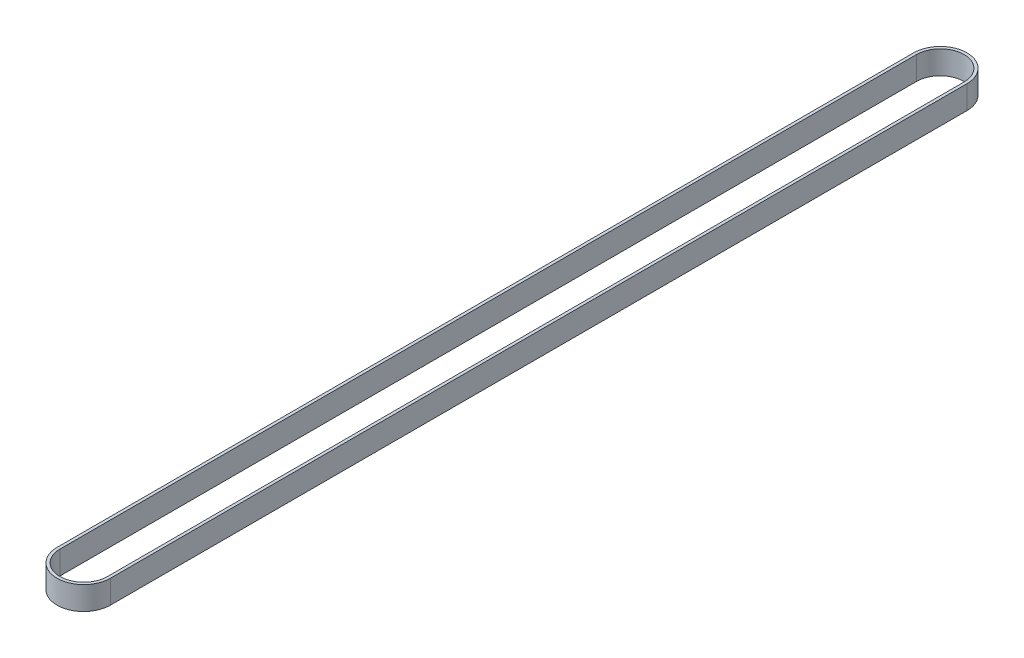
ISO-10303-21;
HEADER;
FILE_DESCRIPTION(('STEP AP214'),'2;1');
FILE_NAME('part.step','',(''),(''),'','','');
FILE_SCHEMA(('AUTOMOTIVE_DESIGN { 1 0 10303 214 1 1 1 1 }'));
ENDSEC;
DATA;
#1=APPLICATION_CONTEXT('core data for automotive mechanical design processes');
#2=APPLICATION_PROTOCOL_DEFINITION('international standard','automotive_design',2000,#1);
#3=PRODUCT_CONTEXT('',#1,'mechanical');
#4=PRODUCT('Part','Part','',(#3));
#5=PRODUCT_RELATED_PRODUCT_CATEGORY('part','',(#4));
#6=PRODUCT_DEFINITION_FORMATION('','',#4);
#7=PRODUCT_DEFINITION_CONTEXT('part definition',#1,'design');
#8=PRODUCT_DEFINITION('design','',#6,#7);
#9=PRODUCT_DEFINITION_SHAPE('','',#8);
#10=(LENGTH_UNIT() NAMED_UNIT(*) SI_UNIT(.MILLI.,.METRE.));
#11=(NAMED_UNIT(*) PLANE_ANGLE_UNIT() SI_UNIT($,.RADIAN.));
#12=(NAMED_UNIT(*) SI_UNIT($,.STERADIAN.) SOLID_ANGLE_UNIT());
#13=UNCERTAINTY_MEASURE_WITH_UNIT(LENGTH_MEASURE(1.E-05),#10,'distance_accuracy_value','');
#14=(GEOMETRIC_REPRESENTATION_CONTEXT(3) GLOBAL_UNCERTAINTY_ASSIGNED_CONTEXT((#13)) GLOBAL_UNIT_ASSIGNED_CONTEXT((#10,
#11,#12)) REPRESENTATION_CONTEXT('',''));
#15=CARTESIAN_POINT('',(0.,0.,0.));
#16=DIRECTION('',(0.,0.,1.));
#17=DIRECTION('',(1.,0.,0.));
#18=AXIS2_PLACEMENT_3D('',#15,#16,#17);
#19=CARTESIAN_POINT('',(0.,6.,110.05));
#20=DIRECTION('',(0.,1.,0.));
#21=DIRECTION('',(0.,0.,1.));
#22=AXIS2_PLACEMENT_3D('',#19,#20,#21);
#23=PLANE('',#22);
#24=CARTESIAN_POINT('',(0.,6.,110.05));
#25=DIRECTION('',(0.,1.,0.));
#26=DIRECTION('',(0.,0.,1.));
#27=AXIS2_PLACEMENT_3D('',#24,#25,#26);
#28=CIRCLE('',#27,6.86000000000003);
#29=CARTESIAN_POINT('',(-6.86000000000003,6.,110.05));
#30=VERTEX_POINT('',#29);
#31=CARTESIAN_POINT('',(6.86000000000003,6.,110.05));
#32=VERTEX_POINT('',#31);
#33=EDGE_CURVE('E142',#30,#32,#28,.T.);
#34=ORIENTED_EDGE('',*,*,#33,.T.);
#35=DIRECTION('',(0.,0.,-1.));
#36=VECTOR('',#35,1.);
#37=CARTESIAN_POINT('',(6.86000000000003,6.,110.05));
#38=LINE('',#37,#36);
#39=CARTESIAN_POINT('',(6.86,6.,-110.05));
#40=VERTEX_POINT('',#39);
#41=EDGE_CURVE('E145',#32,#40,#38,.T.);
#42=ORIENTED_EDGE('',*,*,#41,.T.);
#43=CARTESIAN_POINT('',(0.,6.,-110.05));
#44=DIRECTION('',(0.,1.,0.));
#45=DIRECTION('',(0.,0.,1.));
#46=AXIS2_PLACEMENT_3D('',#43,#44,#45);
#47=CIRCLE('',#46,6.86000000000003);
#48=CARTESIAN_POINT('',(-6.86000000000005,6.,-110.05));
#49=VERTEX_POINT('',#48);
#50=EDGE_CURVE('E148',#40,#49,#47,.T.);
#51=ORIENTED_EDGE('',*,*,#50,.T.);
#52=DIRECTION('',(0.,0.,1.));
#53=VECTOR('',#52,1.);
#54=CARTESIAN_POINT('',(-6.86000000000003,6.,110.05));
#55=LINE('',#54,#53);
#56=EDGE_CURVE('E150',#49,#30,#55,.T.);
#57=ORIENTED_EDGE('',*,*,#56,.T.);
#58=EDGE_LOOP('',(#34,#42,#51,#57));
#59=FACE_BOUND('',#58,.T.);
#60=DIRECTION('',(0.,0.,-1.));
#61=VECTOR('',#60,1.);
#62=CARTESIAN_POINT('',(6.11000000000006,6.,110.05));
#63=LINE('',#62,#61);
#64=CARTESIAN_POINT('',(6.11000000000006,6.,110.05));
#65=VERTEX_POINT('',#64);
#66=CARTESIAN_POINT('',(6.11000000000001,6.,-110.05));
#67=VERTEX_POINT('',#66);
#68=EDGE_CURVE('E114',#65,#67,#63,.T.);
#69=ORIENTED_EDGE('',*,*,#68,.F.);
#70=CARTESIAN_POINT('',(0.,6.,110.05));
#71=DIRECTION('',(0.,1.,0.));
#72=DIRECTION('',(0.,0.,1.));
#73=AXIS2_PLACEMENT_3D('',#70,#71,#72);
#74=CIRCLE('',#73,6.11);
#75=CARTESIAN_POINT('',(-6.10999999999994,6.,110.05));
#76=VERTEX_POINT('',#75);
#77=EDGE_CURVE('E106',#76,#65,#74,.T.);
#78=ORIENTED_EDGE('',*,*,#77,.F.);
#79=DIRECTION('',(0.,0.,1.));
#80=VECTOR('',#79,1.);
#81=CARTESIAN_POINT('',(-6.10999999999994,6.,110.05));
#82=LINE('',#81,#80);
#83=CARTESIAN_POINT('',(-6.10999999999999,6.,-110.05));
#84=VERTEX_POINT('',#83);
#85=EDGE_CURVE('E128',#84,#76,#82,.T.);
#86=ORIENTED_EDGE('',*,*,#85,.F.);
#87=CARTESIAN_POINT('',(0.,6.,-110.05));
#88=DIRECTION('',(0.,1.,0.));
#89=DIRECTION('',(0.,0.,1.));
#90=AXIS2_PLACEMENT_3D('',#87,#88,#89);
#91=CIRCLE('',#90,6.11);
#92=EDGE_CURVE('E126',#67,#84,#91,.T.);
#93=ORIENTED_EDGE('',*,*,#92,.F.);
#94=EDGE_LOOP('',(#69,#78,#86,#93));
#95=FACE_BOUND('',#94,.T.);
#96=ADVANCED_FACE('F41',(#59,#95),#23,.T.);
#97=CARTESIAN_POINT('',(0.,0.,110.05));
#98=DIRECTION('',(0.,1.,0.));
#99=DIRECTION('',(0.,0.,1.));
#100=AXIS2_PLACEMENT_3D('',#97,#98,#99);
#101=PLANE('',#100);
#102=CARTESIAN_POINT('',(0.,0.,110.05));
#103=DIRECTION('',(0.,1.,0.));
#104=DIRECTION('',(0.,0.,1.));
#105=AXIS2_PLACEMENT_3D('',#102,#103,#104);
#106=CIRCLE('',#105,6.86000000000003);
#107=CARTESIAN_POINT('',(-6.86000000000003,0.,110.05));
#108=VERTEX_POINT('',#107);
#109=CARTESIAN_POINT('',(6.86000000000003,0.,110.05));
#110=VERTEX_POINT('',#109);
#111=EDGE_CURVE('E122',#108,#110,#106,.T.);
#112=ORIENTED_EDGE('',*,*,#111,.F.);
#113=DIRECTION('',(0.,0.,1.));
#114=VECTOR('',#113,1.);
#115=CARTESIAN_POINT('',(-6.86000000000003,0.,110.05));
#116=LINE('',#115,#114);
#117=CARTESIAN_POINT('',(-6.86000000000005,0.,-110.05));
#118=VERTEX_POINT('',#117);
#119=EDGE_CURVE('E146',#118,#108,#116,.T.);
#120=ORIENTED_EDGE('',*,*,#119,.F.);
#121=CARTESIAN_POINT('',(0.,0.,-110.05));
#122=DIRECTION('',(0.,1.,0.));
#123=DIRECTION('',(0.,0.,1.));
#124=AXIS2_PLACEMENT_3D('',#121,#122,#123);
#125=CIRCLE('',#124,6.86000000000003);
#126=CARTESIAN_POINT('',(6.86,0.,-110.05));
#127=VERTEX_POINT('',#126);
#128=EDGE_CURVE('E157',#127,#118,#125,.T.);
#129=ORIENTED_EDGE('',*,*,#128,.F.);
#130=DIRECTION('',(0.,0.,-1.));
#131=VECTOR('',#130,1.);
#132=CARTESIAN_POINT('',(6.86000000000003,0.,110.05));
#133=LINE('',#132,#131);
#134=EDGE_CURVE('E155',#110,#127,#133,.T.);
#135=ORIENTED_EDGE('',*,*,#134,.F.);
#136=EDGE_LOOP('',(#112,#120,#129,#135));
#137=FACE_BOUND('',#136,.T.);
#138=CARTESIAN_POINT('',(0.,0.,110.05));
#139=DIRECTION('',(0.,1.,0.));
#140=DIRECTION('',(0.,0.,1.));
#141=AXIS2_PLACEMENT_3D('',#138,#139,#140);
#142=CIRCLE('',#141,6.11);
#143=CARTESIAN_POINT('',(-6.10999999999994,0.,110.05));
#144=VERTEX_POINT('',#143);
#145=CARTESIAN_POINT('',(6.11000000000006,0.,110.05));
#146=VERTEX_POINT('',#145);
#147=EDGE_CURVE('E64',#144,#146,#142,.T.);
#148=ORIENTED_EDGE('',*,*,#147,.T.);
#149=DIRECTION('',(0.,0.,-1.));
#150=VECTOR('',#149,1.);
#151=CARTESIAN_POINT('',(6.11000000000006,0.,110.05));
#152=LINE('',#151,#150);
#153=CARTESIAN_POINT('',(6.11000000000001,0.,-110.05));
#154=VERTEX_POINT('',#153);
#155=EDGE_CURVE('E121',#146,#154,#152,.T.);
#156=ORIENTED_EDGE('',*,*,#155,.T.);
#157=CARTESIAN_POINT('',(0.,0.,-110.05));
#158=DIRECTION('',(0.,1.,0.));
#159=DIRECTION('',(0.,0.,1.));
#160=AXIS2_PLACEMENT_3D('',#157,#158,#159);
#161=CIRCLE('',#160,6.11);
#162=CARTESIAN_POINT('',(-6.10999999999999,0.,-110.05));
#163=VERTEX_POINT('',#162);
#164=EDGE_CURVE('E134',#154,#163,#161,.T.);
#165=ORIENTED_EDGE('',*,*,#164,.T.);
#166=DIRECTION('',(0.,0.,1.));
#167=VECTOR('',#166,1.);
#168=CARTESIAN_POINT('',(-6.10999999999994,0.,110.05));
#169=LINE('',#168,#167);
#170=EDGE_CURVE('E115',#163,#144,#169,.T.);
#171=ORIENTED_EDGE('',*,*,#170,.T.);
#172=EDGE_LOOP('',(#148,#156,#165,#171));
#173=FACE_BOUND('',#172,.T.);
#174=ADVANCED_FACE('F175',(#137,#173),#101,.F.);
#175=CARTESIAN_POINT('',(0.,6.,110.05));
#176=DIRECTION('',(0.,-1.,0.));
#177=DIRECTION('',(0.,0.,-1.));
#178=AXIS2_PLACEMENT_3D('',#175,#176,#177);
#179=CYLINDRICAL_SURFACE('',#178,6.86000000000003);
#180=ORIENTED_EDGE('',*,*,#111,.T.);
#181=DIRECTION('',(0.,-1.,0.));
#182=VECTOR('',#181,1.);
#183=CARTESIAN_POINT('',(6.86000000000003,6.,110.05));
#184=LINE('',#183,#182);
#185=EDGE_CURVE('E11',#32,#110,#184,.T.);
#186=ORIENTED_EDGE('',*,*,#185,.F.);
#187=ORIENTED_EDGE('',*,*,#33,.F.);
#188=DIRECTION('',(0.,-1.,0.));
#189=VECTOR('',#188,1.);
#190=CARTESIAN_POINT('',(-6.86000000000003,6.,110.05));
#191=LINE('',#190,#189);
#192=EDGE_CURVE('E152',#30,#108,#191,.T.);
#193=ORIENTED_EDGE('',*,*,#192,.T.);
#194=EDGE_LOOP('',(#180,#186,#187,#193));
#195=FACE_BOUND('',#194,.T.);
#196=ADVANCED_FACE('F43',(#195),#179,.T.);
#197=CARTESIAN_POINT('',(6.86000000000003,6.,110.05));
#198=DIRECTION('',(-1.,0.,0.));
#199=DIRECTION('',(0.,0.,1.));
#200=AXIS2_PLACEMENT_3D('',#197,#198,#199);
#201=PLANE('',#200);
#202=ORIENTED_EDGE('',*,*,#134,.T.);
#203=DIRECTION('',(0.,-1.,0.));
#204=VECTOR('',#203,1.);
#205=CARTESIAN_POINT('',(6.86,6.,-110.05));
#206=LINE('',#205,#204);
#207=EDGE_CURVE('E49',#40,#127,#206,.T.);
#208=ORIENTED_EDGE('',*,*,#207,.F.);
#209=ORIENTED_EDGE('',*,*,#41,.F.);
#210=ORIENTED_EDGE('',*,*,#185,.T.);
#211=EDGE_LOOP('',(#202,#208,#209,#210));
#212=FACE_BOUND('',#211,.T.);
#213=ADVANCED_FACE('F185',(#212),#201,.F.);
#214=CARTESIAN_POINT('',(0.,6.,-110.05));
#215=DIRECTION('',(0.,-1.,0.));
#216=DIRECTION('',(0.,0.,-1.));
#217=AXIS2_PLACEMENT_3D('',#214,#215,#216);
#218=CYLINDRICAL_SURFACE('',#217,6.86000000000003);
#219=ORIENTED_EDGE('',*,*,#128,.T.);
#220=DIRECTION('',(0.,-1.,0.));
#221=VECTOR('',#220,1.);
#222=CARTESIAN_POINT('',(-6.86000000000005,6.,-110.05));
#223=LINE('',#222,#221);
#224=EDGE_CURVE('E162',#49,#118,#223,.T.);
#225=ORIENTED_EDGE('',*,*,#224,.F.);
#226=ORIENTED_EDGE('',*,*,#50,.F.);
#227=ORIENTED_EDGE('',*,*,#207,.T.);
#228=EDGE_LOOP('',(#219,#225,#226,#227));
#229=FACE_BOUND('',#228,.T.);
#230=ADVANCED_FACE('F169',(#229),#218,.T.);
#231=CARTESIAN_POINT('',(-6.86000000000003,6.,110.05));
#232=DIRECTION('',(1.,0.,0.));
#233=DIRECTION('',(0.,0.,-1.));
#234=AXIS2_PLACEMENT_3D('',#231,#232,#233);
#235=PLANE('',#234);
#236=ORIENTED_EDGE('',*,*,#119,.T.);
#237=ORIENTED_EDGE('',*,*,#192,.F.);
#238=ORIENTED_EDGE('',*,*,#56,.F.);
#239=ORIENTED_EDGE('',*,*,#224,.T.);
#240=EDGE_LOOP('',(#236,#237,#238,#239));
#241=FACE_BOUND('',#240,.T.);
#242=ADVANCED_FACE('F179',(#241),#235,.F.);
#243=CARTESIAN_POINT('',(0.,6.,110.05));
#244=DIRECTION('',(0.,-1.,0.));
#245=DIRECTION('',(0.,0.,-1.));
#246=AXIS2_PLACEMENT_3D('',#243,#244,#245);
#247=CYLINDRICAL_SURFACE('',#246,6.11);
#248=ORIENTED_EDGE('',*,*,#147,.F.);
#249=DIRECTION('',(0.,-1.,0.));
#250=VECTOR('',#249,1.);
#251=CARTESIAN_POINT('',(-6.10999999999994,6.,110.05));
#252=LINE('',#251,#250);
#253=EDGE_CURVE('E110',#76,#144,#252,.T.);
#254=ORIENTED_EDGE('',*,*,#253,.F.);
#255=ORIENTED_EDGE('',*,*,#77,.T.);
#256=DIRECTION('',(0.,-1.,0.));
#257=VECTOR('',#256,1.);
#258=CARTESIAN_POINT('',(6.11000000000006,6.,110.05));
#259=LINE('',#258,#257);
#260=EDGE_CURVE('E109',#65,#146,#259,.T.);
#261=ORIENTED_EDGE('',*,*,#260,.T.);
#262=EDGE_LOOP('',(#248,#254,#255,#261));
#263=FACE_BOUND('',#262,.T.);
#264=ADVANCED_FACE('F108',(#263),#247,.F.);
#265=CARTESIAN_POINT('',(6.11000000000006,6.,110.05));
#266=DIRECTION('',(-1.,0.,0.));
#267=DIRECTION('',(0.,0.,1.));
#268=AXIS2_PLACEMENT_3D('',#265,#266,#267);
#269=PLANE('',#268);
#270=ORIENTED_EDGE('',*,*,#155,.F.);
#271=ORIENTED_EDGE('',*,*,#260,.F.);
#272=ORIENTED_EDGE('',*,*,#68,.T.);
#273=DIRECTION('',(0.,-1.,0.));
#274=VECTOR('',#273,1.);
#275=CARTESIAN_POINT('',(6.11000000000001,6.,-110.05));
#276=LINE('',#275,#274);
#277=EDGE_CURVE('E123',#67,#154,#276,.T.);
#278=ORIENTED_EDGE('',*,*,#277,.T.);
#279=EDGE_LOOP('',(#270,#271,#272,#278));
#280=FACE_BOUND('',#279,.T.);
#281=ADVANCED_FACE('F118',(#280),#269,.T.);
#282=CARTESIAN_POINT('',(0.,6.,-110.05));
#283=DIRECTION('',(0.,-1.,0.));
#284=DIRECTION('',(0.,0.,-1.));
#285=AXIS2_PLACEMENT_3D('',#282,#283,#284);
#286=CYLINDRICAL_SURFACE('',#285,6.11);
#287=ORIENTED_EDGE('',*,*,#164,.F.);
#288=ORIENTED_EDGE('',*,*,#277,.F.);
#289=ORIENTED_EDGE('',*,*,#92,.T.);
#290=DIRECTION('',(0.,-1.,0.));
#291=VECTOR('',#290,1.);
#292=CARTESIAN_POINT('',(-6.10999999999999,6.,-110.05));
#293=LINE('',#292,#291);
#294=EDGE_CURVE('E56',#84,#163,#293,.T.);
#295=ORIENTED_EDGE('',*,*,#294,.T.);
#296=EDGE_LOOP('',(#287,#288,#289,#295));
#297=FACE_BOUND('',#296,.T.);
#298=ADVANCED_FACE('F208',(#297),#286,.F.);
#299=CARTESIAN_POINT('',(-6.10999999999994,6.,110.05));
#300=DIRECTION('',(1.,0.,0.));
#301=DIRECTION('',(0.,0.,-1.));
#302=AXIS2_PLACEMENT_3D('',#299,#300,#301);
#303=PLANE('',#302);
#304=ORIENTED_EDGE('',*,*,#170,.F.);
#305=ORIENTED_EDGE('',*,*,#294,.F.);
#306=ORIENTED_EDGE('',*,*,#85,.T.);
#307=ORIENTED_EDGE('',*,*,#253,.T.);
#308=EDGE_LOOP('',(#304,#305,#306,#307));
#309=FACE_BOUND('',#308,.T.);
#310=ADVANCED_FACE('F212',(#309),#303,.T.);
#311=CLOSED_SHELL('',(#96,#174,#196,#213,#230,#242,#264,#281,#298,#310));
#312=MANIFOLD_SOLID_BREP('B2',#311);
#313=ADVANCED_BREP_SHAPE_REPRESENTATION('',(#18,#312),#14);
#314=SHAPE_DEFINITION_REPRESENTATION(#9,#313);
ENDSEC;
END-ISO-10303-21;
